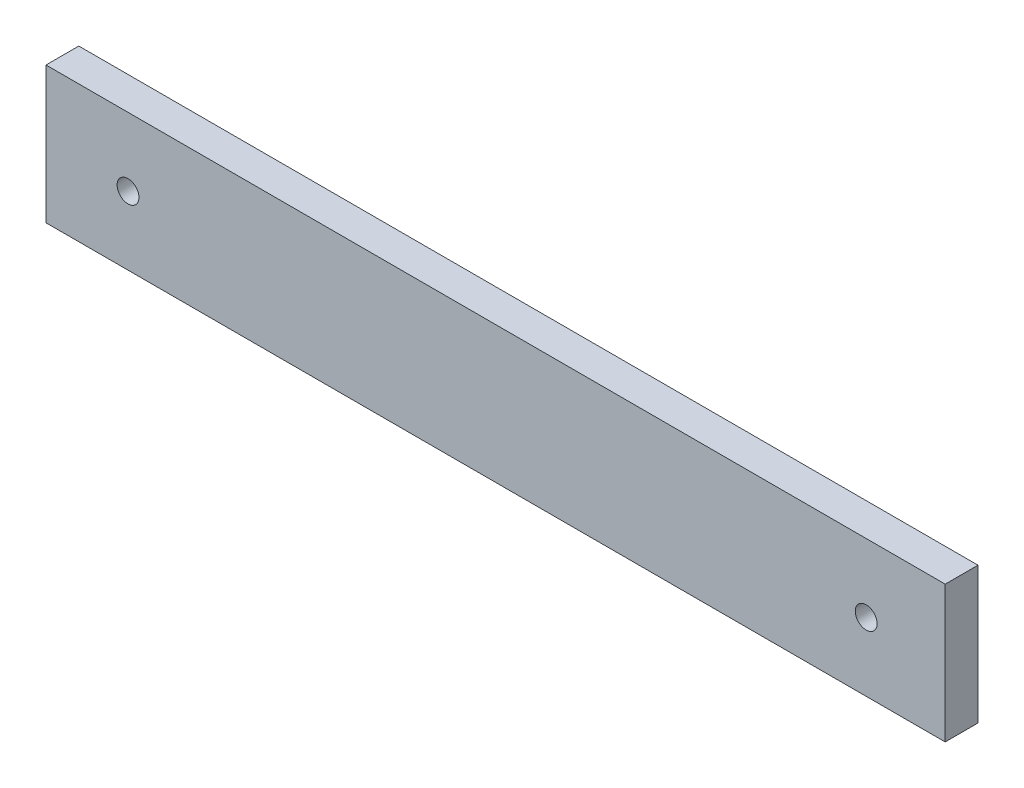
ISO-10303-21;
HEADER;
FILE_DESCRIPTION(('STEP AP214'),'2;1');
FILE_NAME('part.step','',(''),(''),'','','');
FILE_SCHEMA(('AUTOMOTIVE_DESIGN { 1 0 10303 214 1 1 1 1 }'));
ENDSEC;
DATA;
#1=APPLICATION_CONTEXT('core data for automotive mechanical design processes');
#2=APPLICATION_PROTOCOL_DEFINITION('international standard','automotive_design',2000,#1);
#3=PRODUCT_CONTEXT('',#1,'mechanical');
#4=PRODUCT('Part','Part','',(#3));
#5=PRODUCT_RELATED_PRODUCT_CATEGORY('part','',(#4));
#6=PRODUCT_DEFINITION_FORMATION('','',#4);
#7=PRODUCT_DEFINITION_CONTEXT('part definition',#1,'design');
#8=PRODUCT_DEFINITION('design','',#6,#7);
#9=PRODUCT_DEFINITION_SHAPE('','',#8);
#10=(LENGTH_UNIT() NAMED_UNIT(*) SI_UNIT(.MILLI.,.METRE.));
#11=(NAMED_UNIT(*) PLANE_ANGLE_UNIT() SI_UNIT($,.RADIAN.));
#12=(NAMED_UNIT(*) SI_UNIT($,.STERADIAN.) SOLID_ANGLE_UNIT());
#13=UNCERTAINTY_MEASURE_WITH_UNIT(LENGTH_MEASURE(1.E-05),#10,'distance_accuracy_value','');
#14=(GEOMETRIC_REPRESENTATION_CONTEXT(3) GLOBAL_UNCERTAINTY_ASSIGNED_CONTEXT((#13)) GLOBAL_UNIT_ASSIGNED_CONTEXT((#10,
#11,#12)) REPRESENTATION_CONTEXT('',''));
#15=CARTESIAN_POINT('',(0.,0.,0.));
#16=DIRECTION('',(0.,0.,1.));
#17=DIRECTION('',(1.,0.,0.));
#18=AXIS2_PLACEMENT_3D('',#15,#16,#17);
#19=CARTESIAN_POINT('',(0.,0.,6.));
#20=DIRECTION('',(0.,0.,-1.));
#21=DIRECTION('',(-1.,0.,0.));
#22=AXIS2_PLACEMENT_3D('',#19,#20,#21);
#23=PLANE('',#22);
#24=DIRECTION('',(-1.,0.,0.));
#25=VECTOR('',#24,1.);
#26=CARTESIAN_POINT('',(-135.,2.50000000000007,6.));
#27=LINE('',#26,#25);
#28=CARTESIAN_POINT('',(29.4490264064962,2.50000000000007,6.));
#29=VERTEX_POINT('',#28);
#30=CARTESIAN_POINT('',(-135.,2.50000000000007,6.));
#31=VERTEX_POINT('',#30);
#32=EDGE_CURVE('E85',#29,#31,#27,.T.);
#33=ORIENTED_EDGE('',*,*,#32,.T.);
#34=DIRECTION('',(0.,-1.,0.));
#35=VECTOR('',#34,1.);
#36=CARTESIAN_POINT('',(-135.,2.50000000000007,6.));
#37=LINE('',#36,#35);
#38=CARTESIAN_POINT('',(-135.,-22.4999999999999,6.));
#39=VERTEX_POINT('',#38);
#40=EDGE_CURVE('E80',#31,#39,#37,.T.);
#41=ORIENTED_EDGE('',*,*,#40,.T.);
#42=DIRECTION('',(1.,0.,0.));
#43=VECTOR('',#42,1.);
#44=CARTESIAN_POINT('',(-135.,-22.4999999999999,6.));
#45=LINE('',#44,#43);
#46=CARTESIAN_POINT('',(29.4490264064962,-22.4999999999999,6.));
#47=VERTEX_POINT('',#46);
#48=EDGE_CURVE('E83',#39,#47,#45,.T.);
#49=ORIENTED_EDGE('',*,*,#48,.T.);
#50=DIRECTION('',(0.,1.,0.));
#51=VECTOR('',#50,1.);
#52=CARTESIAN_POINT('',(29.4490264064962,2.50000000000007,6.));
#53=LINE('',#52,#51);
#54=EDGE_CURVE('E50',#47,#29,#53,.T.);
#55=ORIENTED_EDGE('',*,*,#54,.T.);
#56=EDGE_LOOP('',(#33,#41,#49,#55));
#57=FACE_BOUND('',#56,.T.);
#58=CARTESIAN_POINT('',(15.,-10.,6.));
#59=DIRECTION('',(0.,0.,1.));
#60=DIRECTION('',(1.,0.,0.));
#61=AXIS2_PLACEMENT_3D('',#58,#59,#60);
#62=CIRCLE('',#61,2.);
#63=CARTESIAN_POINT('',(17.,-10.,6.));
#64=VERTEX_POINT('',#63);
#65=EDGE_CURVE('E100',#64,#64,#62,.T.);
#66=ORIENTED_EDGE('',*,*,#65,.F.);
#67=EDGE_LOOP('',(#66));
#68=FACE_BOUND('',#67,.T.);
#69=CARTESIAN_POINT('',(-120.,-10.,6.));
#70=DIRECTION('',(0.,0.,1.));
#71=DIRECTION('',(1.,0.,0.));
#72=AXIS2_PLACEMENT_3D('',#69,#70,#71);
#73=CIRCLE('',#72,2.);
#74=CARTESIAN_POINT('',(-118.,-10.,6.));
#75=VERTEX_POINT('',#74);
#76=EDGE_CURVE('E115',#75,#75,#73,.T.);
#77=ORIENTED_EDGE('',*,*,#76,.F.);
#78=EDGE_LOOP('',(#77));
#79=FACE_BOUND('',#78,.T.);
#80=ADVANCED_FACE('F33',(#57,#68,#79),#23,.F.);
#81=CARTESIAN_POINT('',(0.,0.,0.));
#82=DIRECTION('',(0.,0.,-1.));
#83=DIRECTION('',(-1.,0.,0.));
#84=AXIS2_PLACEMENT_3D('',#81,#82,#83);
#85=PLANE('',#84);
#86=CARTESIAN_POINT('',(15.,-10.,0.));
#87=DIRECTION('',(0.,0.,1.));
#88=DIRECTION('',(1.,0.,0.));
#89=AXIS2_PLACEMENT_3D('',#86,#87,#88);
#90=CIRCLE('',#89,2.);
#91=CARTESIAN_POINT('',(17.,-10.,0.));
#92=VERTEX_POINT('',#91);
#93=EDGE_CURVE('E112',#92,#92,#90,.T.);
#94=ORIENTED_EDGE('',*,*,#93,.T.);
#95=EDGE_LOOP('',(#94));
#96=FACE_BOUND('',#95,.T.);
#97=DIRECTION('',(-1.,0.,0.));
#98=VECTOR('',#97,1.);
#99=CARTESIAN_POINT('',(-135.,2.50000000000007,0.));
#100=LINE('',#99,#98);
#101=CARTESIAN_POINT('',(29.4490264064962,2.50000000000007,0.));
#102=VERTEX_POINT('',#101);
#103=CARTESIAN_POINT('',(-135.,2.50000000000007,0.));
#104=VERTEX_POINT('',#103);
#105=EDGE_CURVE('E97',#102,#104,#100,.T.);
#106=ORIENTED_EDGE('',*,*,#105,.F.);
#107=DIRECTION('',(0.,1.,0.));
#108=VECTOR('',#107,1.);
#109=CARTESIAN_POINT('',(29.4490264064962,2.50000000000007,0.));
#110=LINE('',#109,#108);
#111=CARTESIAN_POINT('',(29.4490264064962,-22.4999999999999,0.));
#112=VERTEX_POINT('',#111);
#113=EDGE_CURVE('E73',#112,#102,#110,.T.);
#114=ORIENTED_EDGE('',*,*,#113,.F.);
#115=DIRECTION('',(1.,0.,0.));
#116=VECTOR('',#115,1.);
#117=CARTESIAN_POINT('',(-135.,-22.4999999999999,0.));
#118=LINE('',#117,#116);
#119=CARTESIAN_POINT('',(-135.,-22.4999999999999,0.));
#120=VERTEX_POINT('',#119);
#121=EDGE_CURVE('E67',#120,#112,#118,.T.);
#122=ORIENTED_EDGE('',*,*,#121,.F.);
#123=DIRECTION('',(0.,-1.,0.));
#124=VECTOR('',#123,1.);
#125=CARTESIAN_POINT('',(-135.,2.50000000000007,0.));
#126=LINE('',#125,#124);
#127=EDGE_CURVE('E89',#104,#120,#126,.T.);
#128=ORIENTED_EDGE('',*,*,#127,.F.);
#129=EDGE_LOOP('',(#106,#114,#122,#128));
#130=FACE_BOUND('',#129,.T.);
#131=CARTESIAN_POINT('',(-120.,-10.,0.));
#132=DIRECTION('',(0.,0.,1.));
#133=DIRECTION('',(1.,0.,0.));
#134=AXIS2_PLACEMENT_3D('',#131,#132,#133);
#135=CIRCLE('',#134,2.);
#136=CARTESIAN_POINT('',(-118.,-10.,0.));
#137=VERTEX_POINT('',#136);
#138=EDGE_CURVE('E118',#137,#137,#135,.T.);
#139=ORIENTED_EDGE('',*,*,#138,.T.);
#140=EDGE_LOOP('',(#139));
#141=FACE_BOUND('',#140,.T.);
#142=ADVANCED_FACE('F108',(#96,#130,#141),#85,.T.);
#143=CARTESIAN_POINT('',(-135.,2.50000000000007,6.));
#144=DIRECTION('',(0.,-1.,0.));
#145=DIRECTION('',(0.,0.,-1.));
#146=AXIS2_PLACEMENT_3D('',#143,#144,#145);
#147=PLANE('',#146);
#148=ORIENTED_EDGE('',*,*,#105,.T.);
#149=DIRECTION('',(0.,0.,-1.));
#150=VECTOR('',#149,1.);
#151=CARTESIAN_POINT('',(-135.,2.50000000000007,6.));
#152=LINE('',#151,#150);
#153=EDGE_CURVE('E11',#31,#104,#152,.T.);
#154=ORIENTED_EDGE('',*,*,#153,.F.);
#155=ORIENTED_EDGE('',*,*,#32,.F.);
#156=DIRECTION('',(0.,0.,-1.));
#157=VECTOR('',#156,1.);
#158=CARTESIAN_POINT('',(29.4490264064962,2.50000000000007,6.));
#159=LINE('',#158,#157);
#160=EDGE_CURVE('E93',#29,#102,#159,.T.);
#161=ORIENTED_EDGE('',*,*,#160,.T.);
#162=EDGE_LOOP('',(#148,#154,#155,#161));
#163=FACE_BOUND('',#162,.T.);
#164=ADVANCED_FACE('F35',(#163),#147,.F.);
#165=CARTESIAN_POINT('',(-135.,2.50000000000007,6.));
#166=DIRECTION('',(1.,0.,0.));
#167=DIRECTION('',(0.,0.,-1.));
#168=AXIS2_PLACEMENT_3D('',#165,#166,#167);
#169=PLANE('',#168);
#170=ORIENTED_EDGE('',*,*,#127,.T.);
#171=DIRECTION('',(0.,0.,-1.));
#172=VECTOR('',#171,1.);
#173=CARTESIAN_POINT('',(-135.,-22.4999999999999,6.));
#174=LINE('',#173,#172);
#175=EDGE_CURVE('E42',#39,#120,#174,.T.);
#176=ORIENTED_EDGE('',*,*,#175,.F.);
#177=ORIENTED_EDGE('',*,*,#40,.F.);
#178=ORIENTED_EDGE('',*,*,#153,.T.);
#179=EDGE_LOOP('',(#170,#176,#177,#178));
#180=FACE_BOUND('',#179,.T.);
#181=ADVANCED_FACE('F88',(#180),#169,.F.);
#182=CARTESIAN_POINT('',(-135.,-22.4999999999999,6.));
#183=DIRECTION('',(0.,1.,0.));
#184=DIRECTION('',(0.,0.,1.));
#185=AXIS2_PLACEMENT_3D('',#182,#183,#184);
#186=PLANE('',#185);
#187=ORIENTED_EDGE('',*,*,#121,.T.);
#188=DIRECTION('',(0.,0.,-1.));
#189=VECTOR('',#188,1.);
#190=CARTESIAN_POINT('',(29.4490264064962,-22.4999999999999,6.));
#191=LINE('',#190,#189);
#192=EDGE_CURVE('E90',#47,#112,#191,.T.);
#193=ORIENTED_EDGE('',*,*,#192,.F.);
#194=ORIENTED_EDGE('',*,*,#48,.F.);
#195=ORIENTED_EDGE('',*,*,#175,.T.);
#196=EDGE_LOOP('',(#187,#193,#194,#195));
#197=FACE_BOUND('',#196,.T.);
#198=ADVANCED_FACE('F91',(#197),#186,.F.);
#199=CARTESIAN_POINT('',(29.4490264064962,2.50000000000007,6.));
#200=DIRECTION('',(-1.,0.,0.));
#201=DIRECTION('',(0.,0.,1.));
#202=AXIS2_PLACEMENT_3D('',#199,#200,#201);
#203=PLANE('',#202);
#204=ORIENTED_EDGE('',*,*,#113,.T.);
#205=ORIENTED_EDGE('',*,*,#160,.F.);
#206=ORIENTED_EDGE('',*,*,#54,.F.);
#207=ORIENTED_EDGE('',*,*,#192,.T.);
#208=EDGE_LOOP('',(#204,#205,#206,#207));
#209=FACE_BOUND('',#208,.T.);
#210=ADVANCED_FACE('F105',(#209),#203,.F.);
#211=CARTESIAN_POINT('',(15.,-10.,6.));
#212=DIRECTION('',(0.,0.,-1.));
#213=DIRECTION('',(-1.,0.,0.));
#214=AXIS2_PLACEMENT_3D('',#211,#212,#213);
#215=CYLINDRICAL_SURFACE('',#214,2.);
#216=ORIENTED_EDGE('',*,*,#65,.T.);
#217=EDGE_LOOP('',(#216));
#218=FACE_BOUND('',#217,.T.);
#219=ORIENTED_EDGE('',*,*,#93,.F.);
#220=EDGE_LOOP('',(#219));
#221=FACE_BOUND('',#220,.T.);
#222=ADVANCED_FACE('F135',(#218,#221),#215,.F.);
#223=CARTESIAN_POINT('',(-120.,-10.,6.));
#224=DIRECTION('',(0.,0.,-1.));
#225=DIRECTION('',(-1.,0.,0.));
#226=AXIS2_PLACEMENT_3D('',#223,#224,#225);
#227=CYLINDRICAL_SURFACE('',#226,2.);
#228=ORIENTED_EDGE('',*,*,#76,.T.);
#229=EDGE_LOOP('',(#228));
#230=FACE_BOUND('',#229,.T.);
#231=ORIENTED_EDGE('',*,*,#138,.F.);
#232=EDGE_LOOP('',(#231));
#233=FACE_BOUND('',#232,.T.);
#234=ADVANCED_FACE('F124',(#230,#233),#227,.F.);
#235=CLOSED_SHELL('',(#80,#142,#164,#181,#198,#210,#222,#234));
#236=MANIFOLD_SOLID_BREP('B2',#235);
#237=ADVANCED_BREP_SHAPE_REPRESENTATION('',(#18,#236),#14);
#238=SHAPE_DEFINITION_REPRESENTATION(#9,#237);
ENDSEC;
END-ISO-10303-21;
